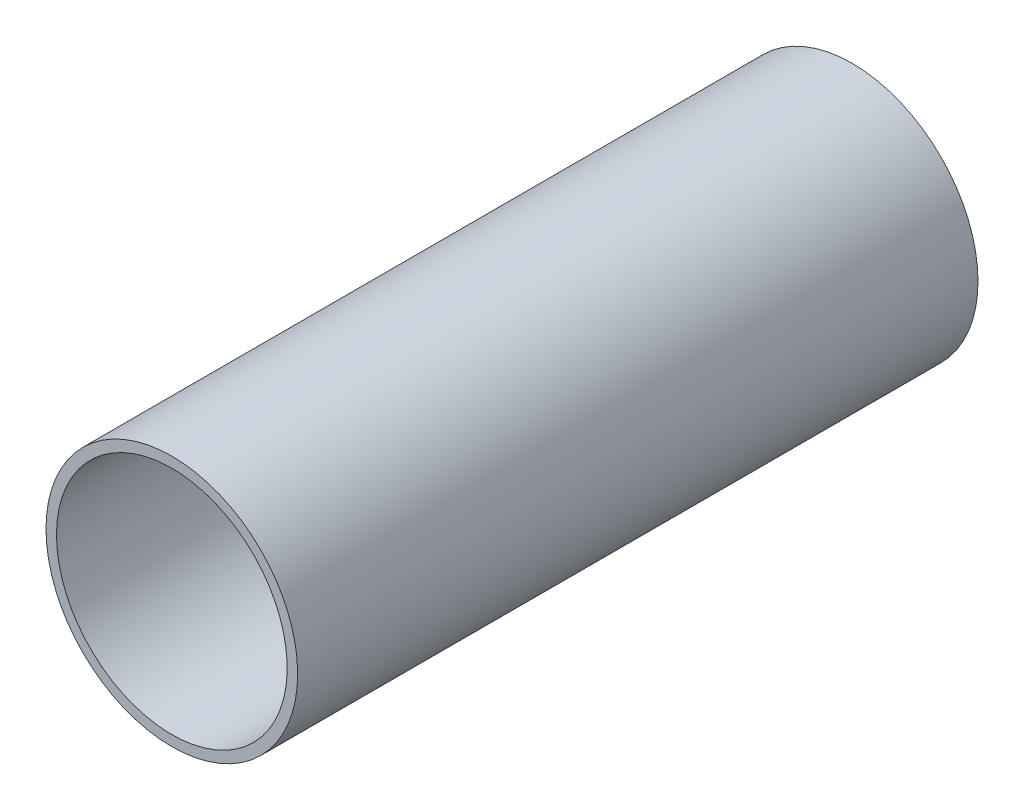
ISO-10303-21;
HEADER;
FILE_DESCRIPTION(('STEP AP214'),'2;1');
FILE_NAME('part.step','',(''),(''),'','','');
FILE_SCHEMA(('AUTOMOTIVE_DESIGN { 1 0 10303 214 1 1 1 1 }'));
ENDSEC;
DATA;
#1=APPLICATION_CONTEXT('core data for automotive mechanical design processes');
#2=APPLICATION_PROTOCOL_DEFINITION('international standard','automotive_design',2000,#1);
#3=PRODUCT_CONTEXT('',#1,'mechanical');
#4=PRODUCT('Part','Part','',(#3));
#5=PRODUCT_RELATED_PRODUCT_CATEGORY('part','',(#4));
#6=PRODUCT_DEFINITION_FORMATION('','',#4);
#7=PRODUCT_DEFINITION_CONTEXT('part definition',#1,'design');
#8=PRODUCT_DEFINITION('design','',#6,#7);
#9=PRODUCT_DEFINITION_SHAPE('','',#8);
#10=(LENGTH_UNIT() NAMED_UNIT(*) SI_UNIT(.MILLI.,.METRE.));
#11=(NAMED_UNIT(*) PLANE_ANGLE_UNIT() SI_UNIT($,.RADIAN.));
#12=(NAMED_UNIT(*) SI_UNIT($,.STERADIAN.) SOLID_ANGLE_UNIT());
#13=UNCERTAINTY_MEASURE_WITH_UNIT(LENGTH_MEASURE(1.E-05),#10,'distance_accuracy_value','');
#14=(GEOMETRIC_REPRESENTATION_CONTEXT(3) GLOBAL_UNCERTAINTY_ASSIGNED_CONTEXT((#13)) GLOBAL_UNIT_ASSIGNED_CONTEXT((#10,
#11,#12)) REPRESENTATION_CONTEXT('',''));
#15=CARTESIAN_POINT('',(0.,0.,0.));
#16=DIRECTION('',(0.,0.,1.));
#17=DIRECTION('',(1.,0.,0.));
#18=AXIS2_PLACEMENT_3D('',#15,#16,#17);
#19=CARTESIAN_POINT('',(-2.22044604925031E-13,0.,206.));
#20=DIRECTION('',(0.,0.,0.999999999999999));
#21=DIRECTION('',(1.,0.,0.));
#22=AXIS2_PLACEMENT_3D('',#19,#20,#21);
#23=PLANE('',#22);
#24=CARTESIAN_POINT('',(-2.22044604925031E-13,0.,206.));
#25=DIRECTION('',(0.,0.,0.999999999999999));
#26=DIRECTION('',(1.,0.,0.));
#27=AXIS2_PLACEMENT_3D('',#24,#25,#26);
#28=CIRCLE('',#27,76.2);
#29=CARTESIAN_POINT('',(-76.2000000000002,0.,206.));
#30=VERTEX_POINT('',#29);
#31=EDGE_CURVE('E12',#30,#30,#28,.T.);
#32=ORIENTED_EDGE('',*,*,#31,.T.);
#33=EDGE_LOOP('',(#32));
#34=FACE_BOUND('',#33,.T.);
#35=CARTESIAN_POINT('',(-2.22044604925031E-13,0.,206.));
#36=DIRECTION('',(0.,0.,0.999999999999999));
#37=DIRECTION('',(1.,0.,0.));
#38=AXIS2_PLACEMENT_3D('',#35,#36,#37);
#39=CIRCLE('',#38,69.85);
#40=CARTESIAN_POINT('',(-69.8500000000002,0.,206.));
#41=VERTEX_POINT('',#40);
#42=EDGE_CURVE('E56',#41,#41,#39,.T.);
#43=ORIENTED_EDGE('',*,*,#42,.F.);
#44=EDGE_LOOP('',(#43));
#45=FACE_BOUND('',#44,.T.);
#46=ADVANCED_FACE('F42',(#34,#45),#23,.T.);
#47=CARTESIAN_POINT('',(2.22044604925031E-13,-2.22044604925031E-13,-205.999999999999));
#48=DIRECTION('',(0.,0.,0.999999999999999));
#49=DIRECTION('',(1.,0.,0.));
#50=AXIS2_PLACEMENT_3D('',#47,#48,#49);
#51=PLANE('',#50);
#52=CARTESIAN_POINT('',(2.22044604925031E-13,-2.22044604925031E-13,-205.999999999999));
#53=DIRECTION('',(0.,0.,0.999999999999999));
#54=DIRECTION('',(1.,0.,0.));
#55=AXIS2_PLACEMENT_3D('',#52,#53,#54);
#56=CIRCLE('',#55,76.2);
#57=CARTESIAN_POINT('',(-76.2000000000002,0.,-205.999999999999));
#58=VERTEX_POINT('',#57);
#59=EDGE_CURVE('E46',#58,#58,#56,.T.);
#60=ORIENTED_EDGE('',*,*,#59,.F.);
#61=EDGE_LOOP('',(#60));
#62=FACE_BOUND('',#61,.T.);
#63=CARTESIAN_POINT('',(2.22044604925031E-13,-2.22044604925031E-13,-205.999999999999));
#64=DIRECTION('',(0.,0.,0.999999999999999));
#65=DIRECTION('',(1.,0.,0.));
#66=AXIS2_PLACEMENT_3D('',#63,#64,#65);
#67=CIRCLE('',#66,69.85);
#68=CARTESIAN_POINT('',(-69.8500000000002,0.,-205.999999999999));
#69=VERTEX_POINT('',#68);
#70=EDGE_CURVE('E58',#69,#69,#67,.T.);
#71=ORIENTED_EDGE('',*,*,#70,.T.);
#72=EDGE_LOOP('',(#71));
#73=FACE_BOUND('',#72,.T.);
#74=ADVANCED_FACE('F71',(#62,#73),#51,.F.);
#75=CARTESIAN_POINT('',(-2.22044604925031E-13,0.,206.));
#76=DIRECTION('',(0.,0.,-0.999999999999999));
#77=DIRECTION('',(-1.,0.,0.));
#78=AXIS2_PLACEMENT_3D('',#75,#76,#77);
#79=CYLINDRICAL_SURFACE('',#78,76.2);
#80=CARTESIAN_POINT('',(-76.2000000000002,0.,206.));
#81=CARTESIAN_POINT('',(-76.2000000000002,0.,201.708333333333));
#82=CARTESIAN_POINT('',(-76.2000000000002,0.,197.416666666666));
#83=CARTESIAN_POINT('',(-76.2000000000002,0.,188.833333333333));
#84=CARTESIAN_POINT('',(-76.2000000000002,0.,184.541666666666));
#85=CARTESIAN_POINT('',(-76.2000000000002,0.,175.958333333333));
#86=CARTESIAN_POINT('',(-76.2000000000002,0.,171.666666666666));
#87=CARTESIAN_POINT('',(-76.2000000000002,0.,163.083333333333));
#88=CARTESIAN_POINT('',(-76.2000000000002,0.,158.791666666666));
#89=CARTESIAN_POINT('',(-76.2000000000002,0.,150.208333333333));
#90=CARTESIAN_POINT('',(-76.2000000000002,0.,145.916666666667));
#91=CARTESIAN_POINT('',(-76.2000000000002,0.,137.333333333333));
#92=CARTESIAN_POINT('',(-76.2000000000002,0.,133.041666666667));
#93=CARTESIAN_POINT('',(-76.2000000000002,0.,124.458333333333));
#94=CARTESIAN_POINT('',(-76.2000000000002,0.,120.166666666667));
#95=CARTESIAN_POINT('',(-76.2000000000002,0.,111.583333333333));
#96=CARTESIAN_POINT('',(-76.2000000000002,0.,107.291666666667));
#97=CARTESIAN_POINT('',(-76.2000000000002,0.,98.7083333333333));
#98=CARTESIAN_POINT('',(-76.2000000000002,0.,94.4166666666666));
#99=CARTESIAN_POINT('',(-76.2000000000002,0.,85.8333333333333));
#100=CARTESIAN_POINT('',(-76.2000000000002,0.,81.5416666666667));
#101=CARTESIAN_POINT('',(-76.2000000000002,0.,72.9583333333334));
#102=CARTESIAN_POINT('',(-76.2000000000002,0.,68.6666666666667));
#103=CARTESIAN_POINT('',(-76.2000000000002,0.,60.0833333333334));
#104=CARTESIAN_POINT('',(-76.2000000000002,0.,55.7916666666667));
#105=CARTESIAN_POINT('',(-76.2000000000002,0.,47.2083333333334));
#106=CARTESIAN_POINT('',(-76.2000000000002,0.,42.9166666666668));
#107=CARTESIAN_POINT('',(-76.2000000000002,0.,34.3333333333335));
#108=CARTESIAN_POINT('',(-76.2000000000002,0.,30.0416666666668));
#109=CARTESIAN_POINT('',(-76.2000000000002,0.,21.4583333333335));
#110=CARTESIAN_POINT('',(-76.2000000000002,0.,17.1666666666668));
#111=CARTESIAN_POINT('',(-76.2000000000002,0.,8.58333333333353));
#112=CARTESIAN_POINT('',(-76.2000000000002,0.,4.29166666666686));
#113=CARTESIAN_POINT('',(-76.2000000000002,0.,-4.29166666666646));
#114=CARTESIAN_POINT('',(-76.2000000000002,0.,-8.58333333333312));
#115=CARTESIAN_POINT('',(-76.2000000000002,0.,-17.1666666666664));
#116=CARTESIAN_POINT('',(-76.2000000000002,0.,-21.4583333333331));
#117=CARTESIAN_POINT('',(-76.2000000000002,0.,-30.0416666666664));
#118=CARTESIAN_POINT('',(-76.2000000000002,0.,-34.3333333333331));
#119=CARTESIAN_POINT('',(-76.2000000000002,0.,-42.9166666666664));
#120=CARTESIAN_POINT('',(-76.2000000000002,0.,-47.208333333333));
#121=CARTESIAN_POINT('',(-76.2000000000002,0.,-55.7916666666664));
#122=CARTESIAN_POINT('',(-76.2000000000002,0.,-60.083333333333));
#123=CARTESIAN_POINT('',(-76.2000000000002,0.,-68.6666666666663));
#124=CARTESIAN_POINT('',(-76.2000000000002,0.,-72.958333333333));
#125=CARTESIAN_POINT('',(-76.2000000000002,0.,-81.5416666666662));
#126=CARTESIAN_POINT('',(-76.2000000000002,0.,-85.8333333333329));
#127=CARTESIAN_POINT('',(-76.2000000000002,0.,-94.4166666666662));
#128=CARTESIAN_POINT('',(-76.2000000000002,0.,-98.7083333333329));
#129=CARTESIAN_POINT('',(-76.2000000000002,0.,-107.291666666666));
#130=CARTESIAN_POINT('',(-76.2000000000002,0.,-111.583333333333));
#131=CARTESIAN_POINT('',(-76.2000000000002,0.,-120.166666666666));
#132=CARTESIAN_POINT('',(-76.2000000000002,0.,-124.458333333333));
#133=CARTESIAN_POINT('',(-76.2000000000002,0.,-133.041666666666));
#134=CARTESIAN_POINT('',(-76.2000000000002,0.,-137.333333333333));
#135=CARTESIAN_POINT('',(-76.2000000000002,0.,-145.916666666666));
#136=CARTESIAN_POINT('',(-76.2000000000002,0.,-150.208333333333));
#137=CARTESIAN_POINT('',(-76.2000000000002,0.,-158.791666666666));
#138=CARTESIAN_POINT('',(-76.2000000000002,0.,-163.083333333333));
#139=CARTESIAN_POINT('',(-76.2000000000002,0.,-171.666666666666));
#140=CARTESIAN_POINT('',(-76.2000000000002,0.,-175.958333333333));
#141=CARTESIAN_POINT('',(-76.2000000000002,0.,-184.541666666666));
#142=CARTESIAN_POINT('',(-76.2000000000002,0.,-188.833333333333));
#143=CARTESIAN_POINT('',(-76.2000000000002,0.,-197.416666666666));
#144=CARTESIAN_POINT('',(-76.2000000000002,0.,-201.708333333333));
#145=CARTESIAN_POINT('',(-76.2000000000002,0.,-205.999999999999));
#146=B_SPLINE_CURVE_WITH_KNOTS('',3,(#80,#81,#82,#83,#84,#85,#86,#87,#88,#89,#90,#91,#92,#93,
#94,#95,#96,#97,#98,#99,#100,#101,#102,#103,#104,#105,#106,#107,#108,#109,#110,#111,#112,#113,
#114,#115,#116,#117,#118,#119,#120,#121,#122,#123,#124,#125,#126,#127,#128,#129,#130,#131,#132,
#133,#134,#135,#136,#137,#138,#139,#140,#141,#142,#143,#144,#145),.UNSPECIFIED.,.F.,.F.,(4,2,2,
2,2,2,2,2,2,2,2,2,2,2,2,2,2,2,2,2,2,2,2,2,2,2,2,2,2,2,2,2,4),(0.,12.875,25.75,38.6249999999999,
51.4999999999999,64.3749999999999,77.2499999999998,90.1249999999998,103.,115.875,128.75,141.625,
154.5,167.375,180.25,193.125,206.,218.875,231.749999999999,244.624999999999,257.499999999999,
270.374999999999,283.249999999999,296.124999999999,308.999999999999,321.874999999999,
334.749999999999,347.624999999999,360.499999999999,373.374999999999,386.249999999999,
399.124999999999,411.999999999999),.UNSPECIFIED.);
#147=EDGE_CURVE('BSEAM44',#30,#58,#146,.T.);
#148=ORIENTED_EDGE('',*,*,#31,.F.);
#149=ORIENTED_EDGE('',*,*,#59,.T.);
#150=ORIENTED_EDGE('',*,*,#147,.T.);
#151=ORIENTED_EDGE('',*,*,#147,.F.);
#152=EDGE_LOOP('',(#148,#150,#149,#151));
#153=FACE_BOUND('',#152,.T.);
#154=ADVANCED_FACE('F44',(#153),#79,.T.);
#155=CARTESIAN_POINT('',(-2.22044604925031E-13,0.,206.));
#156=DIRECTION('',(0.,0.,-0.999999999999999));
#157=DIRECTION('',(-1.,0.,0.));
#158=AXIS2_PLACEMENT_3D('',#155,#156,#157);
#159=CYLINDRICAL_SURFACE('',#158,69.85);
#160=CARTESIAN_POINT('',(-69.8500000000002,0.,206.));
#161=CARTESIAN_POINT('',(-69.8500000000002,0.,201.708333333333));
#162=CARTESIAN_POINT('',(-69.8500000000002,0.,197.416666666666));
#163=CARTESIAN_POINT('',(-69.8500000000002,0.,188.833333333333));
#164=CARTESIAN_POINT('',(-69.8500000000002,0.,184.541666666666));
#165=CARTESIAN_POINT('',(-69.8500000000002,0.,175.958333333333));
#166=CARTESIAN_POINT('',(-69.8500000000002,0.,171.666666666666));
#167=CARTESIAN_POINT('',(-69.8500000000002,0.,163.083333333333));
#168=CARTESIAN_POINT('',(-69.8500000000002,0.,158.791666666666));
#169=CARTESIAN_POINT('',(-69.8500000000002,0.,150.208333333333));
#170=CARTESIAN_POINT('',(-69.8500000000002,0.,145.916666666667));
#171=CARTESIAN_POINT('',(-69.8500000000002,0.,137.333333333333));
#172=CARTESIAN_POINT('',(-69.8500000000002,0.,133.041666666667));
#173=CARTESIAN_POINT('',(-69.8500000000002,0.,124.458333333333));
#174=CARTESIAN_POINT('',(-69.8500000000002,0.,120.166666666667));
#175=CARTESIAN_POINT('',(-69.8500000000002,0.,111.583333333333));
#176=CARTESIAN_POINT('',(-69.8500000000002,0.,107.291666666667));
#177=CARTESIAN_POINT('',(-69.8500000000002,0.,98.7083333333333));
#178=CARTESIAN_POINT('',(-69.8500000000002,0.,94.4166666666666));
#179=CARTESIAN_POINT('',(-69.8500000000002,0.,85.8333333333333));
#180=CARTESIAN_POINT('',(-69.8500000000002,0.,81.5416666666667));
#181=CARTESIAN_POINT('',(-69.8500000000002,0.,72.9583333333334));
#182=CARTESIAN_POINT('',(-69.8500000000002,0.,68.6666666666667));
#183=CARTESIAN_POINT('',(-69.8500000000002,0.,60.0833333333334));
#184=CARTESIAN_POINT('',(-69.8500000000002,0.,55.7916666666667));
#185=CARTESIAN_POINT('',(-69.8500000000002,0.,47.2083333333334));
#186=CARTESIAN_POINT('',(-69.8500000000002,0.,42.9166666666668));
#187=CARTESIAN_POINT('',(-69.8500000000002,0.,34.3333333333335));
#188=CARTESIAN_POINT('',(-69.8500000000002,0.,30.0416666666668));
#189=CARTESIAN_POINT('',(-69.8500000000002,0.,21.4583333333335));
#190=CARTESIAN_POINT('',(-69.8500000000002,0.,17.1666666666668));
#191=CARTESIAN_POINT('',(-69.8500000000002,0.,8.58333333333353));
#192=CARTESIAN_POINT('',(-69.8500000000002,0.,4.29166666666686));
#193=CARTESIAN_POINT('',(-69.8500000000002,0.,-4.29166666666646));
#194=CARTESIAN_POINT('',(-69.8500000000002,0.,-8.58333333333312));
#195=CARTESIAN_POINT('',(-69.8500000000002,0.,-17.1666666666664));
#196=CARTESIAN_POINT('',(-69.8500000000002,0.,-21.4583333333331));
#197=CARTESIAN_POINT('',(-69.8500000000002,0.,-30.0416666666664));
#198=CARTESIAN_POINT('',(-69.8500000000002,0.,-34.3333333333331));
#199=CARTESIAN_POINT('',(-69.8500000000002,0.,-42.9166666666664));
#200=CARTESIAN_POINT('',(-69.8500000000002,0.,-47.2083333333331));
#201=CARTESIAN_POINT('',(-69.8500000000002,0.,-55.7916666666664));
#202=CARTESIAN_POINT('',(-69.8500000000002,0.,-60.0833333333331));
#203=CARTESIAN_POINT('',(-69.8500000000002,0.,-68.6666666666663));
#204=CARTESIAN_POINT('',(-69.8500000000002,0.,-72.958333333333));
#205=CARTESIAN_POINT('',(-69.8500000000002,0.,-81.5416666666663));
#206=CARTESIAN_POINT('',(-69.8500000000002,0.,-85.8333333333329));
#207=CARTESIAN_POINT('',(-69.8500000000002,0.,-94.4166666666663));
#208=CARTESIAN_POINT('',(-69.8500000000002,0.,-98.7083333333329));
#209=CARTESIAN_POINT('',(-69.8500000000002,0.,-107.291666666666));
#210=CARTESIAN_POINT('',(-69.8500000000002,0.,-111.583333333333));
#211=CARTESIAN_POINT('',(-69.8500000000002,0.,-120.166666666666));
#212=CARTESIAN_POINT('',(-69.8500000000002,0.,-124.458333333333));
#213=CARTESIAN_POINT('',(-69.8500000000002,0.,-133.041666666666));
#214=CARTESIAN_POINT('',(-69.8500000000002,0.,-137.333333333333));
#215=CARTESIAN_POINT('',(-69.8500000000002,0.,-145.916666666666));
#216=CARTESIAN_POINT('',(-69.8500000000002,0.,-150.208333333333));
#217=CARTESIAN_POINT('',(-69.8500000000002,0.,-158.791666666666));
#218=CARTESIAN_POINT('',(-69.8500000000002,0.,-163.083333333333));
#219=CARTESIAN_POINT('',(-69.8500000000002,0.,-171.666666666666));
#220=CARTESIAN_POINT('',(-69.8500000000002,0.,-175.958333333333));
#221=CARTESIAN_POINT('',(-69.8500000000002,0.,-184.541666666666));
#222=CARTESIAN_POINT('',(-69.8500000000002,0.,-188.833333333333));
#223=CARTESIAN_POINT('',(-69.8500000000002,0.,-197.416666666666));
#224=CARTESIAN_POINT('',(-69.8500000000002,0.,-201.708333333333));
#225=CARTESIAN_POINT('',(-69.8500000000002,0.,-205.999999999999));
#226=B_SPLINE_CURVE_WITH_KNOTS('',3,(#160,#161,#162,#163,#164,#165,#166,#167,#168,#169,#170,
#171,#172,#173,#174,#175,#176,#177,#178,#179,#180,#181,#182,#183,#184,#185,#186,#187,#188,#189,
#190,#191,#192,#193,#194,#195,#196,#197,#198,#199,#200,#201,#202,#203,#204,#205,#206,#207,#208,
#209,#210,#211,#212,#213,#214,#215,#216,#217,#218,#219,#220,#221,#222,#223,#224,#225),
.UNSPECIFIED.,.F.,.F.,(4,2,2,2,2,2,2,2,2,2,2,2,2,2,2,2,2,2,2,2,2,2,2,2,2,2,2,2,2,2,2,2,4),(0.,
12.875,25.75,38.6249999999999,51.4999999999999,64.3749999999999,77.2499999999998,
90.1249999999998,103.,115.875,128.75,141.625,154.5,167.375,180.25,193.125,206.,218.875,
231.749999999999,244.624999999999,257.499999999999,270.374999999999,283.249999999999,
296.124999999999,308.999999999999,321.874999999999,334.749999999999,347.624999999999,
360.499999999999,373.374999999999,386.249999999999,399.124999999999,411.999999999999),.UNSPECIFIED.);
#227=EDGE_CURVE('BSEAM67',#41,#69,#226,.T.);
#228=ORIENTED_EDGE('',*,*,#42,.T.);
#229=ORIENTED_EDGE('',*,*,#70,.F.);
#230=ORIENTED_EDGE('',*,*,#227,.T.);
#231=ORIENTED_EDGE('',*,*,#227,.F.);
#232=EDGE_LOOP('',(#228,#230,#229,#231));
#233=FACE_BOUND('',#232,.T.);
#234=ADVANCED_FACE('F67',(#233),#159,.F.);
#235=CLOSED_SHELL('',(#46,#74,#154,#234));
#236=MANIFOLD_SOLID_BREP('B2',#235);
#237=ADVANCED_BREP_SHAPE_REPRESENTATION('',(#18,#236),#14);
#238=SHAPE_DEFINITION_REPRESENTATION(#9,#237);
ENDSEC;
END-ISO-10303-21;
